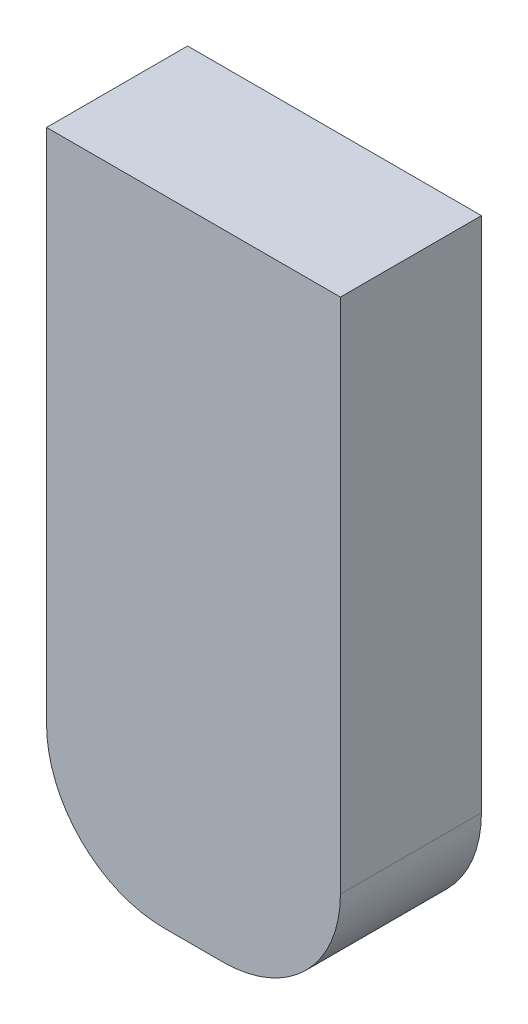
ISO-10303-21;
HEADER;
FILE_DESCRIPTION(('STEP AP214'),'2;1');
FILE_NAME('part.step','',(''),(''),'','','');
FILE_SCHEMA(('AUTOMOTIVE_DESIGN { 1 0 10303 214 1 1 1 1 }'));
ENDSEC;
DATA;
#1=APPLICATION_CONTEXT('core data for automotive mechanical design processes');
#2=APPLICATION_PROTOCOL_DEFINITION('international standard','automotive_design',2000,#1);
#3=PRODUCT_CONTEXT('',#1,'mechanical');
#4=PRODUCT('Part','Part','',(#3));
#5=PRODUCT_RELATED_PRODUCT_CATEGORY('part','',(#4));
#6=PRODUCT_DEFINITION_FORMATION('','',#4);
#7=PRODUCT_DEFINITION_CONTEXT('part definition',#1,'design');
#8=PRODUCT_DEFINITION('design','',#6,#7);
#9=PRODUCT_DEFINITION_SHAPE('','',#8);
#10=(LENGTH_UNIT() NAMED_UNIT(*) SI_UNIT(.MILLI.,.METRE.));
#11=(NAMED_UNIT(*) PLANE_ANGLE_UNIT() SI_UNIT($,.RADIAN.));
#12=(NAMED_UNIT(*) SI_UNIT($,.STERADIAN.) SOLID_ANGLE_UNIT());
#13=UNCERTAINTY_MEASURE_WITH_UNIT(LENGTH_MEASURE(1.E-05),#10,'distance_accuracy_value','');
#14=(GEOMETRIC_REPRESENTATION_CONTEXT(3) GLOBAL_UNCERTAINTY_ASSIGNED_CONTEXT((#13)) GLOBAL_UNIT_ASSIGNED_CONTEXT((#10,
#11,#12)) REPRESENTATION_CONTEXT('',''));
#15=CARTESIAN_POINT('',(0.,0.,0.));
#16=DIRECTION('',(0.,0.,1.));
#17=DIRECTION('',(1.,0.,0.));
#18=AXIS2_PLACEMENT_3D('',#15,#16,#17);
#19=CARTESIAN_POINT('',(0.,0.,15.24));
#20=DIRECTION('',(1.,0.,0.));
#21=DIRECTION('',(0.,0.,-1.));
#22=AXIS2_PLACEMENT_3D('',#19,#20,#21);
#23=PLANE('',#22);
#24=DIRECTION('',(0.,-1.,0.));
#25=VECTOR('',#24,1.);
#26=CARTESIAN_POINT('',(0.,0.,0.));
#27=LINE('',#26,#25);
#28=CARTESIAN_POINT('',(0.,68.58,0.));
#29=VERTEX_POINT('',#28);
#30=CARTESIAN_POINT('',(0.,12.7,0.));
#31=VERTEX_POINT('',#30);
#32=EDGE_CURVE('E112',#29,#31,#27,.T.);
#33=ORIENTED_EDGE('',*,*,#32,.T.);
#34=DIRECTION('',(0.,0.,-1.));
#35=VECTOR('',#34,1.);
#36=CARTESIAN_POINT('',(0.,12.7,15.24));
#37=LINE('',#36,#35);
#38=CARTESIAN_POINT('',(0.,12.7,15.24));
#39=VERTEX_POINT('',#38);
#40=EDGE_CURVE('E56',#31,#39,#37,.F.);
#41=ORIENTED_EDGE('',*,*,#40,.T.);
#42=DIRECTION('',(0.,-1.,0.));
#43=VECTOR('',#42,1.);
#44=CARTESIAN_POINT('',(0.,0.,15.24));
#45=LINE('',#44,#43);
#46=CARTESIAN_POINT('',(0.,68.58,15.24));
#47=VERTEX_POINT('',#46);
#48=EDGE_CURVE('E119',#47,#39,#45,.T.);
#49=ORIENTED_EDGE('',*,*,#48,.F.);
#50=DIRECTION('',(0.,0.,-1.));
#51=VECTOR('',#50,1.);
#52=CARTESIAN_POINT('',(0.,68.58,15.24));
#53=LINE('',#52,#51);
#54=EDGE_CURVE('E104',#47,#29,#53,.T.);
#55=ORIENTED_EDGE('',*,*,#54,.T.);
#56=EDGE_LOOP('',(#33,#41,#49,#55));
#57=FACE_BOUND('',#56,.T.);
#58=ADVANCED_FACE('F33',(#57),#23,.F.);
#59=CARTESIAN_POINT('',(0.,0.,15.24));
#60=DIRECTION('',(0.,1.,0.));
#61=DIRECTION('',(0.,0.,1.));
#62=AXIS2_PLACEMENT_3D('',#59,#60,#61);
#63=PLANE('',#62);
#64=DIRECTION('',(1.,0.,0.));
#65=VECTOR('',#64,1.);
#66=CARTESIAN_POINT('',(0.,0.,15.24));
#67=LINE('',#66,#65);
#68=CARTESIAN_POINT('',(12.7,0.,15.24));
#69=VERTEX_POINT('',#68);
#70=CARTESIAN_POINT('',(19.05,0.,15.24));
#71=VERTEX_POINT('',#70);
#72=EDGE_CURVE('E94',#69,#71,#67,.T.);
#73=ORIENTED_EDGE('',*,*,#72,.F.);
#74=DIRECTION('',(0.,0.,-1.));
#75=VECTOR('',#74,1.);
#76=CARTESIAN_POINT('',(12.7,0.,15.24));
#77=LINE('',#76,#75);
#78=CARTESIAN_POINT('',(12.7,0.,0.));
#79=VERTEX_POINT('',#78);
#80=EDGE_CURVE('E122',#69,#79,#77,.T.);
#81=ORIENTED_EDGE('',*,*,#80,.T.);
#82=DIRECTION('',(1.,0.,0.));
#83=VECTOR('',#82,1.);
#84=CARTESIAN_POINT('',(0.,0.,0.));
#85=LINE('',#84,#83);
#86=CARTESIAN_POINT('',(19.05,0.,0.));
#87=VERTEX_POINT('',#86);
#88=EDGE_CURVE('E114',#79,#87,#85,.T.);
#89=ORIENTED_EDGE('',*,*,#88,.T.);
#90=DIRECTION('',(0.,0.,-1.));
#91=VECTOR('',#90,1.);
#92=CARTESIAN_POINT('',(19.05,0.,15.24));
#93=LINE('',#92,#91);
#94=EDGE_CURVE('E103',#87,#71,#93,.F.);
#95=ORIENTED_EDGE('',*,*,#94,.T.);
#96=EDGE_LOOP('',(#73,#81,#89,#95));
#97=FACE_BOUND('',#96,.T.);
#98=ADVANCED_FACE('F135',(#97),#63,.F.);
#99=CARTESIAN_POINT('',(31.75,0.,15.24));
#100=DIRECTION('',(-1.,0.,0.));
#101=DIRECTION('',(0.,0.,1.));
#102=AXIS2_PLACEMENT_3D('',#99,#100,#101);
#103=PLANE('',#102);
#104=DIRECTION('',(0.,1.,0.));
#105=VECTOR('',#104,1.);
#106=CARTESIAN_POINT('',(31.75,0.,15.24));
#107=LINE('',#106,#105);
#108=CARTESIAN_POINT('',(31.75,12.7,15.24));
#109=VERTEX_POINT('',#108);
#110=CARTESIAN_POINT('',(31.75,68.58,15.24));
#111=VERTEX_POINT('',#110);
#112=EDGE_CURVE('E86',#109,#111,#107,.T.);
#113=ORIENTED_EDGE('',*,*,#112,.F.);
#114=DIRECTION('',(0.,0.,-1.));
#115=VECTOR('',#114,1.);
#116=CARTESIAN_POINT('',(31.75,12.7,15.24));
#117=LINE('',#116,#115);
#118=CARTESIAN_POINT('',(31.75,12.7,0.));
#119=VERTEX_POINT('',#118);
#120=EDGE_CURVE('E11',#109,#119,#117,.T.);
#121=ORIENTED_EDGE('',*,*,#120,.T.);
#122=DIRECTION('',(0.,1.,0.));
#123=VECTOR('',#122,1.);
#124=CARTESIAN_POINT('',(31.75,0.,0.));
#125=LINE('',#124,#123);
#126=CARTESIAN_POINT('',(31.75,68.58,0.));
#127=VERTEX_POINT('',#126);
#128=EDGE_CURVE('E100',#119,#127,#125,.T.);
#129=ORIENTED_EDGE('',*,*,#128,.T.);
#130=DIRECTION('',(0.,0.,-1.));
#131=VECTOR('',#130,1.);
#132=CARTESIAN_POINT('',(31.75,68.58,15.24));
#133=LINE('',#132,#131);
#134=EDGE_CURVE('E97',#111,#127,#133,.T.);
#135=ORIENTED_EDGE('',*,*,#134,.F.);
#136=EDGE_LOOP('',(#113,#121,#129,#135));
#137=FACE_BOUND('',#136,.T.);
#138=ADVANCED_FACE('F98',(#137),#103,.F.);
#139=CARTESIAN_POINT('',(0.,68.58,15.24));
#140=DIRECTION('',(0.,-1.,0.));
#141=DIRECTION('',(0.,0.,-1.));
#142=AXIS2_PLACEMENT_3D('',#139,#140,#141);
#143=PLANE('',#142);
#144=DIRECTION('',(-1.,0.,0.));
#145=VECTOR('',#144,1.);
#146=CARTESIAN_POINT('',(0.,68.58,0.));
#147=LINE('',#146,#145);
#148=EDGE_CURVE('E118',#127,#29,#147,.T.);
#149=ORIENTED_EDGE('',*,*,#148,.T.);
#150=ORIENTED_EDGE('',*,*,#54,.F.);
#151=DIRECTION('',(-1.,0.,0.));
#152=VECTOR('',#151,1.);
#153=CARTESIAN_POINT('',(0.,68.58,15.24));
#154=LINE('',#153,#152);
#155=EDGE_CURVE('E90',#111,#47,#154,.T.);
#156=ORIENTED_EDGE('',*,*,#155,.F.);
#157=ORIENTED_EDGE('',*,*,#134,.T.);
#158=EDGE_LOOP('',(#149,#150,#156,#157));
#159=FACE_BOUND('',#158,.T.);
#160=ADVANCED_FACE('F106',(#159),#143,.F.);
#161=CARTESIAN_POINT('',(0.,0.,15.24));
#162=DIRECTION('',(0.,0.,-1.));
#163=DIRECTION('',(-1.,0.,0.));
#164=AXIS2_PLACEMENT_3D('',#161,#162,#163);
#165=PLANE('',#164);
#166=ORIENTED_EDGE('',*,*,#48,.T.);
#167=CARTESIAN_POINT('',(12.7,12.7,15.24));
#168=DIRECTION('',(0.,0.,-1.));
#169=DIRECTION('',(-1.,0.,0.));
#170=AXIS2_PLACEMENT_3D('',#167,#168,#169);
#171=CIRCLE('',#170,12.7);
#172=EDGE_CURVE('E41',#39,#69,#171,.F.);
#173=ORIENTED_EDGE('',*,*,#172,.T.);
#174=ORIENTED_EDGE('',*,*,#72,.T.);
#175=CARTESIAN_POINT('',(19.05,12.7,15.24));
#176=DIRECTION('',(0.,0.,-1.));
#177=DIRECTION('',(-1.,0.,0.));
#178=AXIS2_PLACEMENT_3D('',#175,#176,#177);
#179=CIRCLE('',#178,12.7);
#180=EDGE_CURVE('E48',#71,#109,#179,.F.);
#181=ORIENTED_EDGE('',*,*,#180,.T.);
#182=ORIENTED_EDGE('',*,*,#112,.T.);
#183=ORIENTED_EDGE('',*,*,#155,.T.);
#184=EDGE_LOOP('',(#166,#173,#174,#181,#182,#183));
#185=FACE_BOUND('',#184,.T.);
#186=ADVANCED_FACE('F88',(#185),#165,.F.);
#187=CARTESIAN_POINT('',(0.,0.,0.));
#188=DIRECTION('',(0.,0.,-1.));
#189=DIRECTION('',(-1.,0.,0.));
#190=AXIS2_PLACEMENT_3D('',#187,#188,#189);
#191=PLANE('',#190);
#192=ORIENTED_EDGE('',*,*,#88,.F.);
#193=CARTESIAN_POINT('',(12.7,12.7,0.));
#194=DIRECTION('',(0.,0.,-1.));
#195=DIRECTION('',(-1.,0.,0.));
#196=AXIS2_PLACEMENT_3D('',#193,#194,#195);
#197=CIRCLE('',#196,12.7);
#198=EDGE_CURVE('E127',#79,#31,#197,.T.);
#199=ORIENTED_EDGE('',*,*,#198,.T.);
#200=ORIENTED_EDGE('',*,*,#32,.F.);
#201=ORIENTED_EDGE('',*,*,#148,.F.);
#202=ORIENTED_EDGE('',*,*,#128,.F.);
#203=CARTESIAN_POINT('',(19.05,12.7,0.));
#204=DIRECTION('',(0.,0.,-1.));
#205=DIRECTION('',(-1.,0.,0.));
#206=AXIS2_PLACEMENT_3D('',#203,#204,#205);
#207=CIRCLE('',#206,12.7);
#208=EDGE_CURVE('E125',#119,#87,#207,.T.);
#209=ORIENTED_EDGE('',*,*,#208,.T.);
#210=EDGE_LOOP('',(#192,#199,#200,#201,#202,#209));
#211=FACE_BOUND('',#210,.T.);
#212=ADVANCED_FACE('F141',(#211),#191,.T.);
#213=CARTESIAN_POINT('',(12.7,12.7,15.24));
#214=DIRECTION('',(0.,0.,-1.));
#215=DIRECTION('',(-1.,0.,0.));
#216=AXIS2_PLACEMENT_3D('',#213,#214,#215);
#217=CYLINDRICAL_SURFACE('',#216,12.7);
#218=ORIENTED_EDGE('',*,*,#172,.F.);
#219=ORIENTED_EDGE('',*,*,#40,.F.);
#220=ORIENTED_EDGE('',*,*,#198,.F.);
#221=ORIENTED_EDGE('',*,*,#80,.F.);
#222=EDGE_LOOP('',(#218,#219,#220,#221));
#223=FACE_BOUND('',#222,.T.);
#224=ADVANCED_FACE('F138',(#223),#217,.T.);
#225=CARTESIAN_POINT('',(19.05,12.7,15.24));
#226=DIRECTION('',(0.,0.,-1.));
#227=DIRECTION('',(-1.,0.,0.));
#228=AXIS2_PLACEMENT_3D('',#225,#226,#227);
#229=CYLINDRICAL_SURFACE('',#228,12.7);
#230=ORIENTED_EDGE('',*,*,#180,.F.);
#231=ORIENTED_EDGE('',*,*,#94,.F.);
#232=ORIENTED_EDGE('',*,*,#208,.F.);
#233=ORIENTED_EDGE('',*,*,#120,.F.);
#234=EDGE_LOOP('',(#230,#231,#232,#233));
#235=FACE_BOUND('',#234,.T.);
#236=ADVANCED_FACE('F35',(#235),#229,.T.);
#237=CLOSED_SHELL('',(#58,#98,#138,#160,#186,#212,#224,#236));
#238=MANIFOLD_SOLID_BREP('B2',#237);
#239=ADVANCED_BREP_SHAPE_REPRESENTATION('',(#18,#238),#14);
#240=SHAPE_DEFINITION_REPRESENTATION(#9,#239);
ENDSEC;
END-ISO-10303-21;
